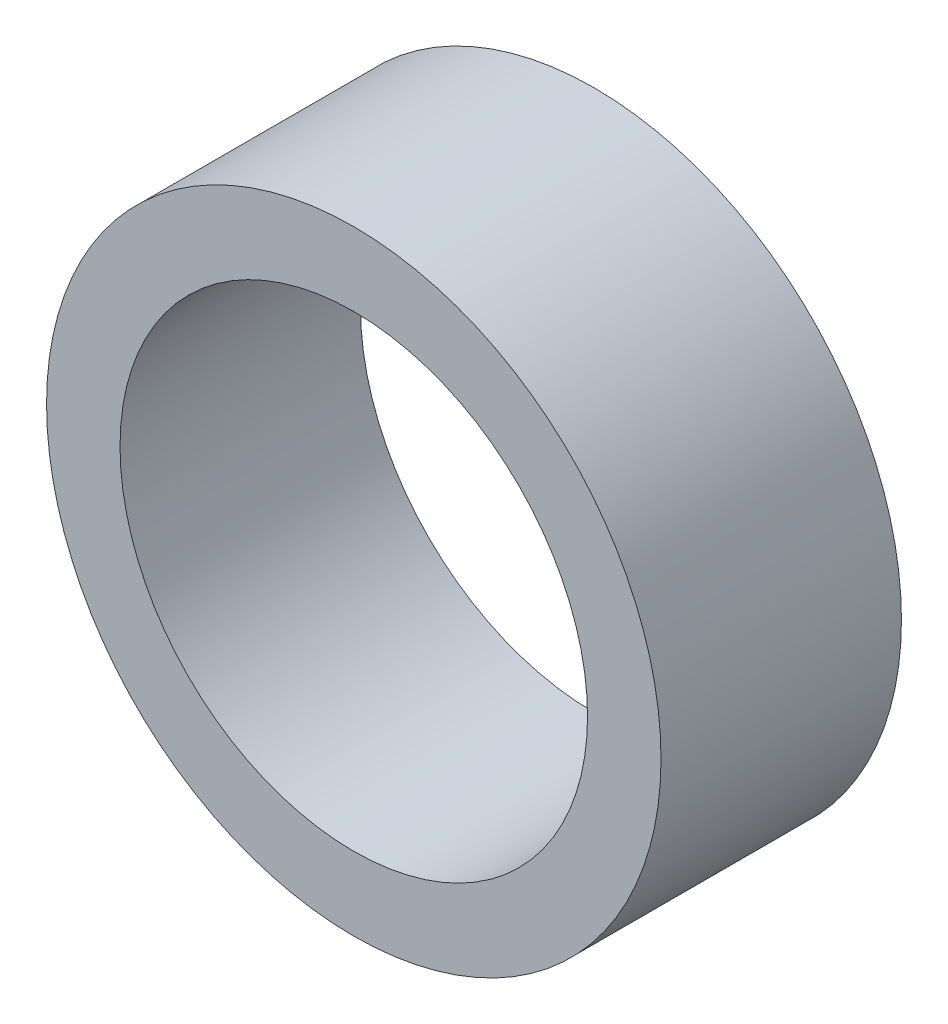
ISO-10303-21;
HEADER;
FILE_DESCRIPTION(('STEP AP214'),'2;1');
FILE_NAME('part.step','',(''),(''),'','','');
FILE_SCHEMA(('AUTOMOTIVE_DESIGN { 1 0 10303 214 1 1 1 1 }'));
ENDSEC;
DATA;
#1=APPLICATION_CONTEXT('core data for automotive mechanical design processes');
#2=APPLICATION_PROTOCOL_DEFINITION('international standard','automotive_design',2000,#1);
#3=PRODUCT_CONTEXT('',#1,'mechanical');
#4=PRODUCT('Part','Part','',(#3));
#5=PRODUCT_RELATED_PRODUCT_CATEGORY('part','',(#4));
#6=PRODUCT_DEFINITION_FORMATION('','',#4);
#7=PRODUCT_DEFINITION_CONTEXT('part definition',#1,'design');
#8=PRODUCT_DEFINITION('design','',#6,#7);
#9=PRODUCT_DEFINITION_SHAPE('','',#8);
#10=(LENGTH_UNIT() NAMED_UNIT(*) SI_UNIT(.MILLI.,.METRE.));
#11=(NAMED_UNIT(*) PLANE_ANGLE_UNIT() SI_UNIT($,.RADIAN.));
#12=(NAMED_UNIT(*) SI_UNIT($,.STERADIAN.) SOLID_ANGLE_UNIT());
#13=UNCERTAINTY_MEASURE_WITH_UNIT(LENGTH_MEASURE(1.E-05),#10,'distance_accuracy_value','');
#14=(GEOMETRIC_REPRESENTATION_CONTEXT(3) GLOBAL_UNCERTAINTY_ASSIGNED_CONTEXT((#13)) GLOBAL_UNIT_ASSIGNED_CONTEXT((#10,
#11,#12)) REPRESENTATION_CONTEXT('',''));
#15=CARTESIAN_POINT('',(0.,0.,0.));
#16=DIRECTION('',(0.,0.,1.));
#17=DIRECTION('',(1.,0.,0.));
#18=AXIS2_PLACEMENT_3D('',#15,#16,#17);
#19=CARTESIAN_POINT('',(0.,0.,9.));
#20=DIRECTION('',(0.,0.,1.));
#21=DIRECTION('',(1.,0.,0.));
#22=AXIS2_PLACEMENT_3D('',#19,#20,#21);
#23=PLANE('',#22);
#24=CARTESIAN_POINT('',(0.,0.,9.));
#25=DIRECTION('',(0.,0.,1.));
#26=DIRECTION('',(1.,0.,0.));
#27=AXIS2_PLACEMENT_3D('',#24,#25,#26);
#28=CIRCLE('',#27,11.5);
#29=CARTESIAN_POINT('',(11.5,0.,9.));
#30=VERTEX_POINT('',#29);
#31=EDGE_CURVE('E10',#30,#30,#28,.T.);
#32=ORIENTED_EDGE('',*,*,#31,.T.);
#33=EDGE_LOOP('',(#32));
#34=FACE_BOUND('',#33,.T.);
#35=CARTESIAN_POINT('',(0.,0.,9.));
#36=DIRECTION('',(0.,0.,1.));
#37=DIRECTION('',(1.,0.,0.));
#38=AXIS2_PLACEMENT_3D('',#35,#36,#37);
#39=CIRCLE('',#38,8.75);
#40=CARTESIAN_POINT('',(8.75,0.,9.));
#41=VERTEX_POINT('',#40);
#42=EDGE_CURVE('E48',#41,#41,#39,.T.);
#43=ORIENTED_EDGE('',*,*,#42,.F.);
#44=EDGE_LOOP('',(#43));
#45=FACE_BOUND('',#44,.T.);
#46=ADVANCED_FACE('F37',(#34,#45),#23,.T.);
#47=CARTESIAN_POINT('',(0.,0.,0.));
#48=DIRECTION('',(0.,0.,1.));
#49=DIRECTION('',(1.,0.,0.));
#50=AXIS2_PLACEMENT_3D('',#47,#48,#49);
#51=PLANE('',#50);
#52=CARTESIAN_POINT('',(0.,0.,0.));
#53=DIRECTION('',(0.,0.,1.));
#54=DIRECTION('',(1.,0.,0.));
#55=AXIS2_PLACEMENT_3D('',#52,#53,#54);
#56=CIRCLE('',#55,11.5);
#57=CARTESIAN_POINT('',(11.5,0.,0.));
#58=VERTEX_POINT('',#57);
#59=EDGE_CURVE('E41',#58,#58,#56,.T.);
#60=ORIENTED_EDGE('',*,*,#59,.F.);
#61=EDGE_LOOP('',(#60));
#62=FACE_BOUND('',#61,.T.);
#63=CARTESIAN_POINT('',(0.,0.,0.));
#64=DIRECTION('',(0.,0.,1.));
#65=DIRECTION('',(1.,0.,0.));
#66=AXIS2_PLACEMENT_3D('',#63,#64,#65);
#67=CIRCLE('',#66,8.75);
#68=CARTESIAN_POINT('',(8.75,0.,0.));
#69=VERTEX_POINT('',#68);
#70=EDGE_CURVE('E50',#69,#69,#67,.T.);
#71=ORIENTED_EDGE('',*,*,#70,.T.);
#72=EDGE_LOOP('',(#71));
#73=FACE_BOUND('',#72,.T.);
#74=ADVANCED_FACE('F60',(#62,#73),#51,.F.);
#75=CARTESIAN_POINT('',(0.,0.,9.));
#76=DIRECTION('',(0.,0.,-1.));
#77=DIRECTION('',(-1.,0.,0.));
#78=AXIS2_PLACEMENT_3D('',#75,#76,#77);
#79=CYLINDRICAL_SURFACE('',#78,11.5);
#80=ORIENTED_EDGE('',*,*,#31,.F.);
#81=EDGE_LOOP('',(#80));
#82=FACE_BOUND('',#81,.T.);
#83=ORIENTED_EDGE('',*,*,#59,.T.);
#84=EDGE_LOOP('',(#83));
#85=FACE_BOUND('',#84,.T.);
#86=ADVANCED_FACE('F39',(#82,#85),#79,.T.);
#87=CARTESIAN_POINT('',(0.,0.,9.));
#88=DIRECTION('',(0.,0.,-1.));
#89=DIRECTION('',(-1.,0.,0.));
#90=AXIS2_PLACEMENT_3D('',#87,#88,#89);
#91=CYLINDRICAL_SURFACE('',#90,8.75);
#92=ORIENTED_EDGE('',*,*,#42,.T.);
#93=EDGE_LOOP('',(#92));
#94=FACE_BOUND('',#93,.T.);
#95=ORIENTED_EDGE('',*,*,#70,.F.);
#96=EDGE_LOOP('',(#95));
#97=FACE_BOUND('',#96,.T.);
#98=ADVANCED_FACE('F56',(#94,#97),#91,.F.);
#99=CLOSED_SHELL('',(#46,#74,#86,#98));
#100=MANIFOLD_SOLID_BREP('B2',#99);
#101=ADVANCED_BREP_SHAPE_REPRESENTATION('',(#18,#100),#14);
#102=SHAPE_DEFINITION_REPRESENTATION(#9,#101);
ENDSEC;
END-ISO-10303-21;
